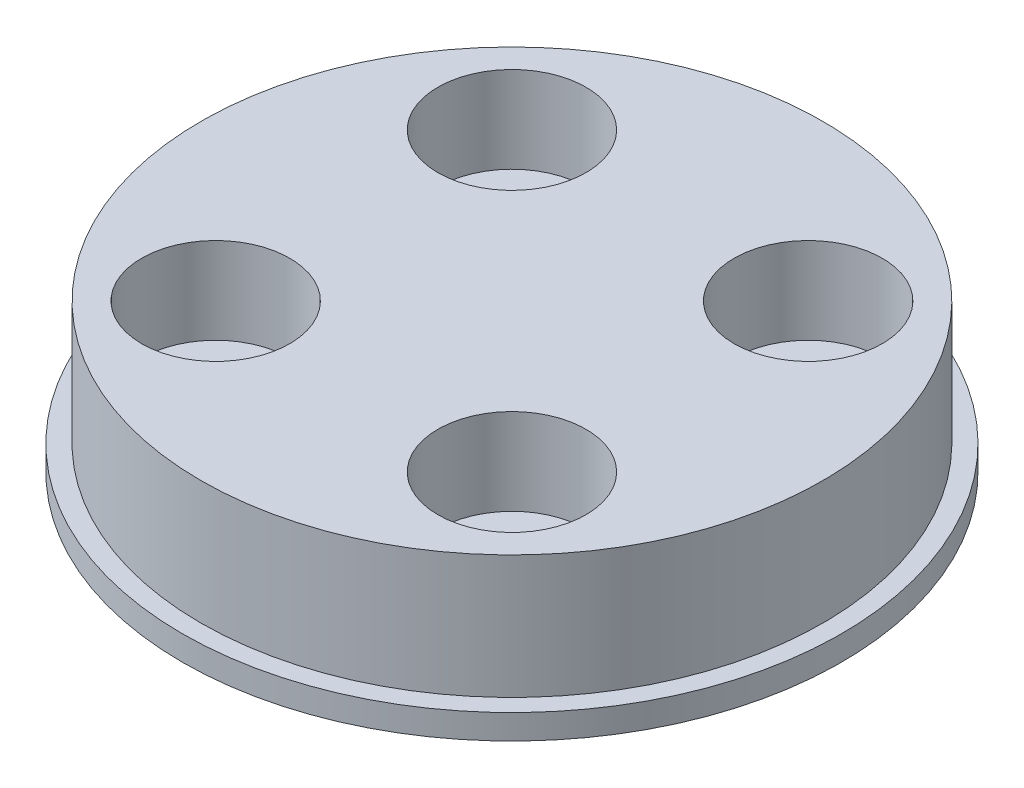
ISO-10303-21;
HEADER;
FILE_DESCRIPTION(('STEP AP214'),'2;1');
FILE_NAME('part.step','',(''),(''),'','','');
FILE_SCHEMA(('AUTOMOTIVE_DESIGN { 1 0 10303 214 1 1 1 1 }'));
ENDSEC;
DATA;
#1=APPLICATION_CONTEXT('core data for automotive mechanical design processes');
#2=APPLICATION_PROTOCOL_DEFINITION('international standard','automotive_design',2000,#1);
#3=PRODUCT_CONTEXT('',#1,'mechanical');
#4=PRODUCT('Part','Part','',(#3));
#5=PRODUCT_RELATED_PRODUCT_CATEGORY('part','',(#4));
#6=PRODUCT_DEFINITION_FORMATION('','',#4);
#7=PRODUCT_DEFINITION_CONTEXT('part definition',#1,'design');
#8=PRODUCT_DEFINITION('design','',#6,#7);
#9=PRODUCT_DEFINITION_SHAPE('','',#8);
#10=(LENGTH_UNIT() NAMED_UNIT(*) SI_UNIT(.MILLI.,.METRE.));
#11=(NAMED_UNIT(*) PLANE_ANGLE_UNIT() SI_UNIT($,.RADIAN.));
#12=(NAMED_UNIT(*) SI_UNIT($,.STERADIAN.) SOLID_ANGLE_UNIT());
#13=UNCERTAINTY_MEASURE_WITH_UNIT(LENGTH_MEASURE(1.E-05),#10,'distance_accuracy_value','');
#14=(GEOMETRIC_REPRESENTATION_CONTEXT(3) GLOBAL_UNCERTAINTY_ASSIGNED_CONTEXT((#13)) GLOBAL_UNIT_ASSIGNED_CONTEXT((#10,
#11,#12)) REPRESENTATION_CONTEXT('',''));
#15=CARTESIAN_POINT('',(0.,0.,0.));
#16=DIRECTION('',(0.,0.,1.));
#17=DIRECTION('',(1.,0.,0.));
#18=AXIS2_PLACEMENT_3D('',#15,#16,#17);
#19=CARTESIAN_POINT('',(-6.00000000000006,34.,5.99999999999994));
#20=DIRECTION('',(0.,-1.,0.));
#21=DIRECTION('',(0.,0.,-1.));
#22=AXIS2_PLACEMENT_3D('',#19,#20,#21);
#23=CYLINDRICAL_SURFACE('',#22,1.575);
#24=CARTESIAN_POINT('',(-6.00000000000006,33.,5.99999999999994));
#25=DIRECTION('',(0.,1.,0.));
#26=DIRECTION('',(0.,0.,1.));
#27=AXIS2_PLACEMENT_3D('',#24,#25,#26);
#28=CIRCLE('',#27,1.575);
#29=CARTESIAN_POINT('',(-6.00000000000006,33.,7.57499999999994));
#30=VERTEX_POINT('',#29);
#31=EDGE_CURVE('E52',#30,#30,#28,.F.);
#32=ORIENTED_EDGE('',*,*,#31,.T.);
#33=EDGE_LOOP('',(#32));
#34=FACE_BOUND('',#33,.T.);
#35=CARTESIAN_POINT('',(-6.00000000000006,35.5,5.99999999999994));
#36=DIRECTION('',(0.,1.,0.));
#37=DIRECTION('',(0.,0.,1.));
#38=AXIS2_PLACEMENT_3D('',#35,#36,#37);
#39=CIRCLE('',#38,1.575);
#40=CARTESIAN_POINT('',(-6.00000000000006,35.5,7.57499999999994));
#41=VERTEX_POINT('',#40);
#42=EDGE_CURVE('E43',#41,#41,#39,.F.);
#43=ORIENTED_EDGE('',*,*,#42,.F.);
#44=EDGE_LOOP('',(#43));
#45=FACE_BOUND('',#44,.T.);
#46=ADVANCED_FACE('F39',(#34,#45),#23,.F.);
#47=CARTESIAN_POINT('',(6.00000000000002,34.,-5.99999999999998));
#48=DIRECTION('',(0.,-1.,0.));
#49=DIRECTION('',(0.,0.,-1.));
#50=AXIS2_PLACEMENT_3D('',#47,#48,#49);
#51=CYLINDRICAL_SURFACE('',#50,1.575);
#52=CARTESIAN_POINT('',(6.00000000000002,33.,-5.99999999999998));
#53=DIRECTION('',(0.,1.,0.));
#54=DIRECTION('',(0.,0.,1.));
#55=AXIS2_PLACEMENT_3D('',#52,#53,#54);
#56=CIRCLE('',#55,1.575);
#57=CARTESIAN_POINT('',(6.00000000000002,33.,-4.42499999999998));
#58=VERTEX_POINT('',#57);
#59=EDGE_CURVE('E64',#58,#58,#56,.F.);
#60=ORIENTED_EDGE('',*,*,#59,.T.);
#61=EDGE_LOOP('',(#60));
#62=FACE_BOUND('',#61,.T.);
#63=CARTESIAN_POINT('',(6.00000000000002,35.5,-5.99999999999998));
#64=DIRECTION('',(0.,1.,0.));
#65=DIRECTION('',(0.,0.,1.));
#66=AXIS2_PLACEMENT_3D('',#63,#64,#65);
#67=CIRCLE('',#66,1.575);
#68=CARTESIAN_POINT('',(6.00000000000002,35.5,-4.42499999999998));
#69=VERTEX_POINT('',#68);
#70=EDGE_CURVE('E75',#69,#69,#67,.F.);
#71=ORIENTED_EDGE('',*,*,#70,.F.);
#72=EDGE_LOOP('',(#71));
#73=FACE_BOUND('',#72,.T.);
#74=ADVANCED_FACE('F138',(#62,#73),#51,.F.);
#75=CARTESIAN_POINT('',(-6.,34.,-6.));
#76=DIRECTION('',(0.,-1.,0.));
#77=DIRECTION('',(0.,0.,-1.));
#78=AXIS2_PLACEMENT_3D('',#75,#76,#77);
#79=CYLINDRICAL_SURFACE('',#78,1.575);
#80=CARTESIAN_POINT('',(-6.,33.,-6.));
#81=DIRECTION('',(0.,1.,0.));
#82=DIRECTION('',(0.,0.,1.));
#83=AXIS2_PLACEMENT_3D('',#80,#81,#82);
#84=CIRCLE('',#83,1.575);
#85=CARTESIAN_POINT('',(-6.,33.,-4.425));
#86=VERTEX_POINT('',#85);
#87=EDGE_CURVE('E61',#86,#86,#84,.F.);
#88=ORIENTED_EDGE('',*,*,#87,.T.);
#89=EDGE_LOOP('',(#88));
#90=FACE_BOUND('',#89,.T.);
#91=CARTESIAN_POINT('',(-6.,35.5,-6.));
#92=DIRECTION('',(0.,1.,0.));
#93=DIRECTION('',(0.,0.,1.));
#94=AXIS2_PLACEMENT_3D('',#91,#92,#93);
#95=CIRCLE('',#94,1.575);
#96=CARTESIAN_POINT('',(-6.,35.5,-4.425));
#97=VERTEX_POINT('',#96);
#98=EDGE_CURVE('E72',#97,#97,#95,.F.);
#99=ORIENTED_EDGE('',*,*,#98,.F.);
#100=EDGE_LOOP('',(#99));
#101=FACE_BOUND('',#100,.T.);
#102=ADVANCED_FACE('F145',(#90,#101),#79,.F.);
#103=CARTESIAN_POINT('',(5.99999999999996,34.,6.00000000000004));
#104=DIRECTION('',(0.,-1.,0.));
#105=DIRECTION('',(0.,0.,-1.));
#106=AXIS2_PLACEMENT_3D('',#103,#104,#105);
#107=CYLINDRICAL_SURFACE('',#106,1.575);
#108=CARTESIAN_POINT('',(5.99999999999996,33.,6.00000000000004));
#109=DIRECTION('',(0.,1.,0.));
#110=DIRECTION('',(0.,0.,1.));
#111=AXIS2_PLACEMENT_3D('',#108,#109,#110);
#112=CIRCLE('',#111,1.575);
#113=CARTESIAN_POINT('',(5.99999999999996,33.,7.57500000000004));
#114=VERTEX_POINT('',#113);
#115=EDGE_CURVE('E58',#114,#114,#112,.F.);
#116=ORIENTED_EDGE('',*,*,#115,.T.);
#117=EDGE_LOOP('',(#116));
#118=FACE_BOUND('',#117,.T.);
#119=CARTESIAN_POINT('',(5.99999999999996,35.5,6.00000000000004));
#120=DIRECTION('',(0.,1.,0.));
#121=DIRECTION('',(0.,0.,1.));
#122=AXIS2_PLACEMENT_3D('',#119,#120,#121);
#123=CIRCLE('',#122,1.575);
#124=CARTESIAN_POINT('',(5.99999999999996,35.5,7.57500000000004));
#125=VERTEX_POINT('',#124);
#126=EDGE_CURVE('E69',#125,#125,#123,.F.);
#127=ORIENTED_EDGE('',*,*,#126,.F.);
#128=EDGE_LOOP('',(#127));
#129=FACE_BOUND('',#128,.T.);
#130=ADVANCED_FACE('F41',(#118,#129),#107,.F.);
#131=CARTESIAN_POINT('',(0.,34.,0.));
#132=DIRECTION('',(0.,-1.,0.));
#133=DIRECTION('',(0.,0.,-1.));
#134=AXIS2_PLACEMENT_3D('',#131,#132,#133);
#135=CYLINDRICAL_SURFACE('',#134,13.35);
#136=CARTESIAN_POINT('',(0.,34.,0.));
#137=DIRECTION('',(0.,1.,0.));
#138=DIRECTION('',(0.,0.,1.));
#139=AXIS2_PLACEMENT_3D('',#136,#137,#138);
#140=CIRCLE('',#139,13.35);
#141=CARTESIAN_POINT('',(0.,34.,13.35));
#142=VERTEX_POINT('',#141);
#143=EDGE_CURVE('E10',#142,#142,#140,.T.);
#144=ORIENTED_EDGE('',*,*,#143,.F.);
#145=EDGE_LOOP('',(#144));
#146=FACE_BOUND('',#145,.T.);
#147=CARTESIAN_POINT('',(0.,33.,0.));
#148=DIRECTION('',(0.,1.,0.));
#149=DIRECTION('',(0.,0.,1.));
#150=AXIS2_PLACEMENT_3D('',#147,#148,#149);
#151=CIRCLE('',#150,13.35);
#152=CARTESIAN_POINT('',(0.,33.,13.35));
#153=VERTEX_POINT('',#152);
#154=EDGE_CURVE('E47',#153,#153,#151,.T.);
#155=ORIENTED_EDGE('',*,*,#154,.T.);
#156=EDGE_LOOP('',(#155));
#157=FACE_BOUND('',#156,.T.);
#158=ADVANCED_FACE('F150',(#146,#157),#135,.T.);
#159=CARTESIAN_POINT('',(0.,34.,0.));
#160=DIRECTION('',(0.,1.,0.));
#161=DIRECTION('',(0.,0.,1.));
#162=AXIS2_PLACEMENT_3D('',#159,#160,#161);
#163=PLANE('',#162);
#164=CARTESIAN_POINT('',(0.,34.,0.));
#165=DIRECTION('',(0.,1.,0.));
#166=DIRECTION('',(0.,0.,1.));
#167=AXIS2_PLACEMENT_3D('',#164,#165,#166);
#168=CIRCLE('',#167,12.6);
#169=CARTESIAN_POINT('',(0.,34.,12.6));
#170=VERTEX_POINT('',#169);
#171=EDGE_CURVE('E56',#170,#170,#168,.F.);
#172=ORIENTED_EDGE('',*,*,#171,.T.);
#173=EDGE_LOOP('',(#172));
#174=FACE_BOUND('',#173,.T.);
#175=ORIENTED_EDGE('',*,*,#143,.T.);
#176=EDGE_LOOP('',(#175));
#177=FACE_BOUND('',#176,.T.);
#178=ADVANCED_FACE('F166',(#174,#177),#163,.T.);
#179=CARTESIAN_POINT('',(0.,33.,0.));
#180=DIRECTION('',(0.,1.,0.));
#181=DIRECTION('',(0.,0.,1.));
#182=AXIS2_PLACEMENT_3D('',#179,#180,#181);
#183=PLANE('',#182);
#184=ORIENTED_EDGE('',*,*,#154,.F.);
#185=EDGE_LOOP('',(#184));
#186=FACE_BOUND('',#185,.T.);
#187=ORIENTED_EDGE('',*,*,#31,.F.);
#188=EDGE_LOOP('',(#187));
#189=FACE_BOUND('',#188,.T.);
#190=ORIENTED_EDGE('',*,*,#59,.F.);
#191=EDGE_LOOP('',(#190));
#192=FACE_BOUND('',#191,.T.);
#193=ORIENTED_EDGE('',*,*,#87,.F.);
#194=EDGE_LOOP('',(#193));
#195=FACE_BOUND('',#194,.T.);
#196=ORIENTED_EDGE('',*,*,#115,.F.);
#197=EDGE_LOOP('',(#196));
#198=FACE_BOUND('',#197,.T.);
#199=ADVANCED_FACE('F163',(#186,#189,#192,#195,#198),#183,.F.);
#200=CARTESIAN_POINT('',(0.,39.,0.));
#201=DIRECTION('',(0.,-1.,0.));
#202=DIRECTION('',(0.,0.,-1.));
#203=AXIS2_PLACEMENT_3D('',#200,#201,#202);
#204=CYLINDRICAL_SURFACE('',#203,12.6);
#205=ORIENTED_EDGE('',*,*,#171,.F.);
#206=EDGE_LOOP('',(#205));
#207=FACE_BOUND('',#206,.T.);
#208=CARTESIAN_POINT('',(0.,39.,0.));
#209=DIRECTION('',(0.,1.,0.));
#210=DIRECTION('',(0.,0.,1.));
#211=AXIS2_PLACEMENT_3D('',#208,#209,#210);
#212=CIRCLE('',#211,12.6);
#213=CARTESIAN_POINT('',(0.,39.,12.6));
#214=VERTEX_POINT('',#213);
#215=EDGE_CURVE('E80',#214,#214,#212,.T.);
#216=ORIENTED_EDGE('',*,*,#215,.F.);
#217=EDGE_LOOP('',(#216));
#218=FACE_BOUND('',#217,.T.);
#219=ADVANCED_FACE('F118',(#207,#218),#204,.T.);
#220=CARTESIAN_POINT('',(0.,39.,0.));
#221=DIRECTION('',(0.,1.,0.));
#222=DIRECTION('',(0.,0.,1.));
#223=AXIS2_PLACEMENT_3D('',#220,#221,#222);
#224=PLANE('',#223);
#225=CARTESIAN_POINT('',(-6.00000000000006,39.,5.99999999999994));
#226=DIRECTION('',(0.,1.,0.));
#227=DIRECTION('',(0.,0.,1.));
#228=AXIS2_PLACEMENT_3D('',#225,#226,#227);
#229=CIRCLE('',#228,3.);
#230=CARTESIAN_POINT('',(-6.00000000000006,39.,8.99999999999994));
#231=VERTEX_POINT('',#230);
#232=EDGE_CURVE('E97',#231,#231,#229,.T.);
#233=ORIENTED_EDGE('',*,*,#232,.F.);
#234=EDGE_LOOP('',(#233));
#235=FACE_BOUND('',#234,.T.);
#236=CARTESIAN_POINT('',(5.99999999999996,39.,6.00000000000004));
#237=DIRECTION('',(0.,1.,0.));
#238=DIRECTION('',(0.,0.,1.));
#239=AXIS2_PLACEMENT_3D('',#236,#237,#238);
#240=CIRCLE('',#239,3.);
#241=CARTESIAN_POINT('',(5.99999999999996,39.,9.00000000000004));
#242=VERTEX_POINT('',#241);
#243=EDGE_CURVE('E103',#242,#242,#240,.T.);
#244=ORIENTED_EDGE('',*,*,#243,.F.);
#245=EDGE_LOOP('',(#244));
#246=FACE_BOUND('',#245,.T.);
#247=CARTESIAN_POINT('',(6.00000000000002,39.,-5.99999999999998));
#248=DIRECTION('',(0.,1.,0.));
#249=DIRECTION('',(0.,0.,1.));
#250=AXIS2_PLACEMENT_3D('',#247,#248,#249);
#251=CIRCLE('',#250,3.);
#252=CARTESIAN_POINT('',(6.00000000000002,39.,-2.99999999999998));
#253=VERTEX_POINT('',#252);
#254=EDGE_CURVE('E91',#253,#253,#251,.T.);
#255=ORIENTED_EDGE('',*,*,#254,.F.);
#256=EDGE_LOOP('',(#255));
#257=FACE_BOUND('',#256,.T.);
#258=CARTESIAN_POINT('',(-6.,39.,-6.));
#259=DIRECTION('',(0.,1.,0.));
#260=DIRECTION('',(0.,0.,1.));
#261=AXIS2_PLACEMENT_3D('',#258,#259,#260);
#262=CIRCLE('',#261,3.);
#263=CARTESIAN_POINT('',(-6.,39.,-3.));
#264=VERTEX_POINT('',#263);
#265=EDGE_CURVE('E88',#264,#264,#262,.T.);
#266=ORIENTED_EDGE('',*,*,#265,.F.);
#267=EDGE_LOOP('',(#266));
#268=FACE_BOUND('',#267,.T.);
#269=ORIENTED_EDGE('',*,*,#215,.T.);
#270=EDGE_LOOP('',(#269));
#271=FACE_BOUND('',#270,.T.);
#272=ADVANCED_FACE('F114',(#235,#246,#257,#268,#271),#224,.T.);
#273=CARTESIAN_POINT('',(-6.,35.5,-6.));
#274=DIRECTION('',(0.,1.,0.));
#275=DIRECTION('',(0.,0.,1.));
#276=AXIS2_PLACEMENT_3D('',#273,#274,#275);
#277=PLANE('',#276);
#278=CARTESIAN_POINT('',(-6.,35.5,-6.));
#279=DIRECTION('',(0.,1.,0.));
#280=DIRECTION('',(0.,0.,1.));
#281=AXIS2_PLACEMENT_3D('',#278,#279,#280);
#282=CIRCLE('',#281,3.);
#283=CARTESIAN_POINT('',(-6.,35.5,-3.));
#284=VERTEX_POINT('',#283);
#285=EDGE_CURVE('E73',#284,#284,#282,.T.);
#286=ORIENTED_EDGE('',*,*,#285,.T.);
#287=EDGE_LOOP('',(#286));
#288=FACE_BOUND('',#287,.T.);
#289=ORIENTED_EDGE('',*,*,#98,.T.);
#290=EDGE_LOOP('',(#289));
#291=FACE_BOUND('',#290,.T.);
#292=ADVANCED_FACE('F117',(#288,#291),#277,.T.);
#293=CARTESIAN_POINT('',(-6.,35.5,-6.));
#294=DIRECTION('',(0.,1.,0.));
#295=DIRECTION('',(0.,0.,1.));
#296=AXIS2_PLACEMENT_3D('',#293,#294,#295);
#297=CYLINDRICAL_SURFACE('',#296,3.);
#298=ORIENTED_EDGE('',*,*,#285,.F.);
#299=EDGE_LOOP('',(#298));
#300=FACE_BOUND('',#299,.T.);
#301=ORIENTED_EDGE('',*,*,#265,.T.);
#302=EDGE_LOOP('',(#301));
#303=FACE_BOUND('',#302,.T.);
#304=ADVANCED_FACE('F123',(#300,#303),#297,.F.);
#305=CARTESIAN_POINT('',(6.00000000000002,35.5,-5.99999999999998));
#306=DIRECTION('',(0.,1.,0.));
#307=DIRECTION('',(0.,0.,1.));
#308=AXIS2_PLACEMENT_3D('',#305,#306,#307);
#309=PLANE('',#308);
#310=CARTESIAN_POINT('',(6.00000000000002,35.5,-5.99999999999998));
#311=DIRECTION('',(0.,1.,0.));
#312=DIRECTION('',(0.,0.,1.));
#313=AXIS2_PLACEMENT_3D('',#310,#311,#312);
#314=CIRCLE('',#313,3.);
#315=CARTESIAN_POINT('',(6.00000000000002,35.5,-2.99999999999998));
#316=VERTEX_POINT('',#315);
#317=EDGE_CURVE('E106',#316,#316,#314,.T.);
#318=ORIENTED_EDGE('',*,*,#317,.T.);
#319=EDGE_LOOP('',(#318));
#320=FACE_BOUND('',#319,.T.);
#321=ORIENTED_EDGE('',*,*,#70,.T.);
#322=EDGE_LOOP('',(#321));
#323=FACE_BOUND('',#322,.T.);
#324=ADVANCED_FACE('F125',(#320,#323),#309,.T.);
#325=CARTESIAN_POINT('',(6.00000000000002,35.5,-5.99999999999998));
#326=DIRECTION('',(0.,1.,0.));
#327=DIRECTION('',(0.,0.,1.));
#328=AXIS2_PLACEMENT_3D('',#325,#326,#327);
#329=CYLINDRICAL_SURFACE('',#328,3.);
#330=ORIENTED_EDGE('',*,*,#317,.F.);
#331=EDGE_LOOP('',(#330));
#332=FACE_BOUND('',#331,.T.);
#333=ORIENTED_EDGE('',*,*,#254,.T.);
#334=EDGE_LOOP('',(#333));
#335=FACE_BOUND('',#334,.T.);
#336=ADVANCED_FACE('F112',(#332,#335),#329,.F.);
#337=CARTESIAN_POINT('',(5.99999999999996,35.5,6.00000000000004));
#338=DIRECTION('',(0.,1.,0.));
#339=DIRECTION('',(0.,0.,1.));
#340=AXIS2_PLACEMENT_3D('',#337,#338,#339);
#341=PLANE('',#340);
#342=CARTESIAN_POINT('',(5.99999999999996,35.5,6.00000000000004));
#343=DIRECTION('',(0.,1.,0.));
#344=DIRECTION('',(0.,0.,1.));
#345=AXIS2_PLACEMENT_3D('',#342,#343,#344);
#346=CIRCLE('',#345,3.);
#347=CARTESIAN_POINT('',(5.99999999999996,35.5,9.00000000000004));
#348=VERTEX_POINT('',#347);
#349=EDGE_CURVE('E100',#348,#348,#346,.T.);
#350=ORIENTED_EDGE('',*,*,#349,.T.);
#351=EDGE_LOOP('',(#350));
#352=FACE_BOUND('',#351,.T.);
#353=ORIENTED_EDGE('',*,*,#126,.T.);
#354=EDGE_LOOP('',(#353));
#355=FACE_BOUND('',#354,.T.);
#356=ADVANCED_FACE('F172',(#352,#355),#341,.T.);
#357=CARTESIAN_POINT('',(5.99999999999996,35.5,6.00000000000004));
#358=DIRECTION('',(0.,1.,0.));
#359=DIRECTION('',(0.,0.,1.));
#360=AXIS2_PLACEMENT_3D('',#357,#358,#359);
#361=CYLINDRICAL_SURFACE('',#360,3.);
#362=ORIENTED_EDGE('',*,*,#349,.F.);
#363=EDGE_LOOP('',(#362));
#364=FACE_BOUND('',#363,.T.);
#365=ORIENTED_EDGE('',*,*,#243,.T.);
#366=EDGE_LOOP('',(#365));
#367=FACE_BOUND('',#366,.T.);
#368=ADVANCED_FACE('F174',(#364,#367),#361,.F.);
#369=CARTESIAN_POINT('',(-6.00000000000006,35.5,5.99999999999994));
#370=DIRECTION('',(0.,1.,0.));
#371=DIRECTION('',(0.,0.,1.));
#372=AXIS2_PLACEMENT_3D('',#369,#370,#371);
#373=PLANE('',#372);
#374=CARTESIAN_POINT('',(-6.00000000000006,35.5,5.99999999999994));
#375=DIRECTION('',(0.,1.,0.));
#376=DIRECTION('',(0.,0.,1.));
#377=AXIS2_PLACEMENT_3D('',#374,#375,#376);
#378=CIRCLE('',#377,3.);
#379=CARTESIAN_POINT('',(-6.00000000000006,35.5,8.99999999999994));
#380=VERTEX_POINT('',#379);
#381=EDGE_CURVE('E94',#380,#380,#378,.T.);
#382=ORIENTED_EDGE('',*,*,#381,.T.);
#383=EDGE_LOOP('',(#382));
#384=FACE_BOUND('',#383,.T.);
#385=ORIENTED_EDGE('',*,*,#42,.T.);
#386=EDGE_LOOP('',(#385));
#387=FACE_BOUND('',#386,.T.);
#388=ADVANCED_FACE('F181',(#384,#387),#373,.T.);
#389=CARTESIAN_POINT('',(-6.00000000000006,35.5,5.99999999999994));
#390=DIRECTION('',(0.,1.,0.));
#391=DIRECTION('',(0.,0.,1.));
#392=AXIS2_PLACEMENT_3D('',#389,#390,#391);
#393=CYLINDRICAL_SURFACE('',#392,3.);
#394=ORIENTED_EDGE('',*,*,#381,.F.);
#395=EDGE_LOOP('',(#394));
#396=FACE_BOUND('',#395,.T.);
#397=ORIENTED_EDGE('',*,*,#232,.T.);
#398=EDGE_LOOP('',(#397));
#399=FACE_BOUND('',#398,.T.);
#400=ADVANCED_FACE('F187',(#396,#399),#393,.F.);
#401=CLOSED_SHELL('',(#46,#74,#102,#130,#158,#178,#199,#219,#272,#292,#304,#324,#336,#356,#368,
#388,#400));
#402=MANIFOLD_SOLID_BREP('B2',#401);
#403=ADVANCED_BREP_SHAPE_REPRESENTATION('',(#18,#402),#14);
#404=SHAPE_DEFINITION_REPRESENTATION(#9,#403);
ENDSEC;
END-ISO-10303-21;
